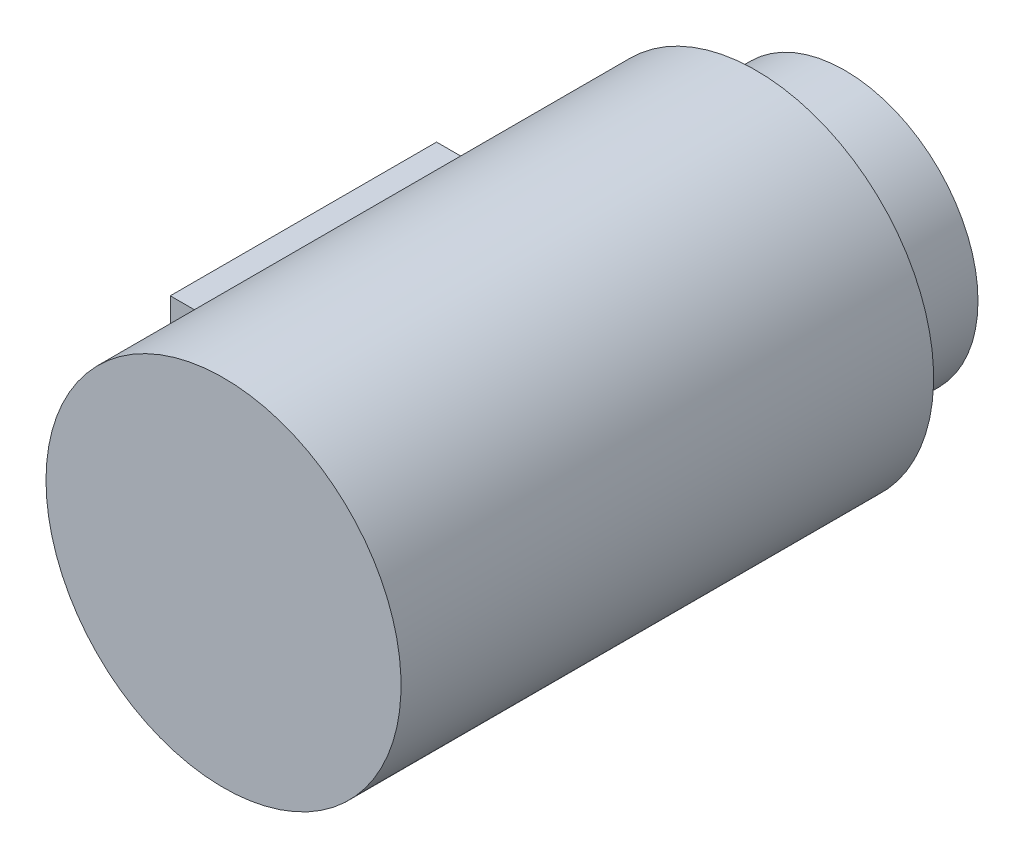
ISO-10303-21;
HEADER;
FILE_DESCRIPTION(('STEP AP214'),'2;1');
FILE_NAME('part.step','',(''),(''),'','','');
FILE_SCHEMA(('AUTOMOTIVE_DESIGN { 1 0 10303 214 1 1 1 1 }'));
ENDSEC;
DATA;
#1=APPLICATION_CONTEXT('core data for automotive mechanical design processes');
#2=APPLICATION_PROTOCOL_DEFINITION('international standard','automotive_design',2000,#1);
#3=PRODUCT_CONTEXT('',#1,'mechanical');
#4=PRODUCT('Part','Part','',(#3));
#5=PRODUCT_RELATED_PRODUCT_CATEGORY('part','',(#4));
#6=PRODUCT_DEFINITION_FORMATION('','',#4);
#7=PRODUCT_DEFINITION_CONTEXT('part definition',#1,'design');
#8=PRODUCT_DEFINITION('design','',#6,#7);
#9=PRODUCT_DEFINITION_SHAPE('','',#8);
#10=(LENGTH_UNIT() NAMED_UNIT(*) SI_UNIT(.MILLI.,.METRE.));
#11=(NAMED_UNIT(*) PLANE_ANGLE_UNIT() SI_UNIT($,.RADIAN.));
#12=(NAMED_UNIT(*) SI_UNIT($,.STERADIAN.) SOLID_ANGLE_UNIT());
#13=UNCERTAINTY_MEASURE_WITH_UNIT(LENGTH_MEASURE(1.E-05),#10,'distance_accuracy_value','');
#14=(GEOMETRIC_REPRESENTATION_CONTEXT(3) GLOBAL_UNCERTAINTY_ASSIGNED_CONTEXT((#13)) GLOBAL_UNIT_ASSIGNED_CONTEXT((#10,
#11,#12)) REPRESENTATION_CONTEXT('',''));
#15=CARTESIAN_POINT('',(0.,0.,0.));
#16=DIRECTION('',(0.,0.,1.));
#17=DIRECTION('',(1.,0.,0.));
#18=AXIS2_PLACEMENT_3D('',#15,#16,#17);
#19=CARTESIAN_POINT('',(0.,0.,-5.));
#20=DIRECTION('',(0.,0.,-1.));
#21=DIRECTION('',(-1.,0.,0.));
#22=AXIS2_PLACEMENT_3D('',#19,#20,#21);
#23=PLANE('',#22);
#24=CARTESIAN_POINT('',(0.,0.,-5.));
#25=DIRECTION('',(0.,0.,1.));
#26=DIRECTION('',(1.,0.,0.));
#27=AXIS2_PLACEMENT_3D('',#24,#25,#26);
#28=CIRCLE('',#27,7.5);
#29=CARTESIAN_POINT('',(7.5,0.,-5.));
#30=VERTEX_POINT('',#29);
#31=EDGE_CURVE('E20',#30,#30,#28,.T.);
#32=ORIENTED_EDGE('',*,*,#31,.F.);
#33=EDGE_LOOP('',(#32));
#34=FACE_BOUND('',#33,.T.);
#35=ADVANCED_FACE('F17',(#34),#23,.T.);
#36=CARTESIAN_POINT('',(0.,0.,-5.));
#37=DIRECTION('',(0.,0.,1.));
#38=DIRECTION('',(1.,0.,0.));
#39=AXIS2_PLACEMENT_3D('',#36,#37,#38);
#40=CYLINDRICAL_SURFACE('',#39,7.5);
#41=ORIENTED_EDGE('',*,*,#31,.T.);
#42=EDGE_LOOP('',(#41));
#43=FACE_BOUND('',#42,.T.);
#44=CARTESIAN_POINT('',(0.,0.,0.));
#45=DIRECTION('',(0.,0.,1.));
#46=DIRECTION('',(1.,0.,0.));
#47=AXIS2_PLACEMENT_3D('',#44,#45,#46);
#48=CIRCLE('',#47,7.5);
#49=CARTESIAN_POINT('',(7.5,0.,0.));
#50=VERTEX_POINT('',#49);
#51=EDGE_CURVE('E74',#50,#50,#48,.F.);
#52=ORIENTED_EDGE('',*,*,#51,.T.);
#53=EDGE_LOOP('',(#52));
#54=FACE_BOUND('',#53,.T.);
#55=ADVANCED_FACE('F189',(#43,#54),#40,.T.);
#56=CARTESIAN_POINT('',(-13.,0.,5.));
#57=DIRECTION('',(1.,0.,0.));
#58=DIRECTION('',(0.,0.,-1.));
#59=AXIS2_PLACEMENT_3D('',#56,#57,#58);
#60=PLANE('',#59);
#61=DIRECTION('',(0.,0.,1.));
#62=VECTOR('',#61,1.);
#63=CARTESIAN_POINT('',(-13.,2.5,5.));
#64=LINE('',#63,#62);
#65=CARTESIAN_POINT('',(-13.,2.5,5.));
#66=VERTEX_POINT('',#65);
#67=CARTESIAN_POINT('',(-13.,2.5,20.));
#68=VERTEX_POINT('',#67);
#69=EDGE_CURVE('E66',#66,#68,#64,.T.);
#70=ORIENTED_EDGE('',*,*,#69,.F.);
#71=DIRECTION('',(0.,1.,0.));
#72=VECTOR('',#71,1.);
#73=CARTESIAN_POINT('',(-13.,0.,5.));
#74=LINE('',#73,#72);
#75=CARTESIAN_POINT('',(-13.,-2.5,5.));
#76=VERTEX_POINT('',#75);
#77=EDGE_CURVE('E76',#66,#76,#74,.F.);
#78=ORIENTED_EDGE('',*,*,#77,.T.);
#79=DIRECTION('',(0.,0.,1.));
#80=VECTOR('',#79,1.);
#81=CARTESIAN_POINT('',(-13.,-2.5,5.));
#82=LINE('',#81,#80);
#83=CARTESIAN_POINT('',(-13.,-2.5,20.));
#84=VERTEX_POINT('',#83);
#85=EDGE_CURVE('E60',#76,#84,#82,.T.);
#86=ORIENTED_EDGE('',*,*,#85,.T.);
#87=DIRECTION('',(0.,1.,0.));
#88=VECTOR('',#87,1.);
#89=CARTESIAN_POINT('',(-13.,0.,20.));
#90=LINE('',#89,#88);
#91=EDGE_CURVE('E94',#68,#84,#90,.F.);
#92=ORIENTED_EDGE('',*,*,#91,.F.);
#93=EDGE_LOOP('',(#70,#78,#86,#92));
#94=FACE_BOUND('',#93,.T.);
#95=ADVANCED_FACE('F77',(#94),#60,.F.);
#96=CARTESIAN_POINT('',(0.,-2.5,5.));
#97=DIRECTION('',(0.,1.,0.));
#98=DIRECTION('',(0.,0.,1.));
#99=AXIS2_PLACEMENT_3D('',#96,#97,#98);
#100=PLANE('',#99);
#101=ORIENTED_EDGE('',*,*,#85,.F.);
#102=DIRECTION('',(1.,0.,0.));
#103=VECTOR('',#102,1.);
#104=CARTESIAN_POINT('',(0.,-2.5,5.));
#105=LINE('',#104,#103);
#106=CARTESIAN_POINT('',(-9.68245836551854,-2.5,5.));
#107=VERTEX_POINT('',#106);
#108=EDGE_CURVE('E71',#76,#107,#105,.T.);
#109=ORIENTED_EDGE('',*,*,#108,.T.);
#110=DIRECTION('',(0.,0.,-1.));
#111=VECTOR('',#110,1.);
#112=CARTESIAN_POINT('',(-9.68245836551854,-2.5,30.));
#113=LINE('',#112,#111);
#114=CARTESIAN_POINT('',(-9.68245836551854,-2.5,20.));
#115=VERTEX_POINT('',#114);
#116=EDGE_CURVE('E89',#115,#107,#113,.T.);
#117=ORIENTED_EDGE('',*,*,#116,.F.);
#118=DIRECTION('',(1.,0.,0.));
#119=VECTOR('',#118,1.);
#120=CARTESIAN_POINT('',(0.,-2.5,20.));
#121=LINE('',#120,#119);
#122=EDGE_CURVE('E72',#84,#115,#121,.T.);
#123=ORIENTED_EDGE('',*,*,#122,.F.);
#124=EDGE_LOOP('',(#101,#109,#117,#123));
#125=FACE_BOUND('',#124,.T.);
#126=ADVANCED_FACE('F69',(#125),#100,.F.);
#127=CARTESIAN_POINT('',(0.,0.,30.));
#128=DIRECTION('',(0.,0.,1.));
#129=DIRECTION('',(1.,0.,0.));
#130=AXIS2_PLACEMENT_3D('',#127,#128,#129);
#131=PLANE('',#130);
#132=CARTESIAN_POINT('',(0.,0.,30.));
#133=DIRECTION('',(0.,0.,-1.));
#134=DIRECTION('',(-1.,0.,0.));
#135=AXIS2_PLACEMENT_3D('',#132,#133,#134);
#136=CIRCLE('',#135,10.);
#137=CARTESIAN_POINT('',(-10.,0.,30.));
#138=VERTEX_POINT('',#137);
#139=EDGE_CURVE('E90',#138,#138,#136,.T.);
#140=ORIENTED_EDGE('',*,*,#139,.F.);
#141=EDGE_LOOP('',(#140));
#142=FACE_BOUND('',#141,.T.);
#143=ADVANCED_FACE('F113',(#142),#131,.T.);
#144=CARTESIAN_POINT('',(0.,0.,0.));
#145=DIRECTION('',(0.,0.,1.));
#146=DIRECTION('',(1.,0.,0.));
#147=AXIS2_PLACEMENT_3D('',#144,#145,#146);
#148=PLANE('',#147);
#149=ORIENTED_EDGE('',*,*,#51,.F.);
#150=EDGE_LOOP('',(#149));
#151=FACE_BOUND('',#150,.T.);
#152=CARTESIAN_POINT('',(0.,0.,0.));
#153=DIRECTION('',(0.,0.,-1.));
#154=DIRECTION('',(-1.,0.,0.));
#155=AXIS2_PLACEMENT_3D('',#152,#153,#154);
#156=CIRCLE('',#155,10.);
#157=CARTESIAN_POINT('',(-10.,0.,0.));
#158=VERTEX_POINT('',#157);
#159=EDGE_CURVE('E105',#158,#158,#156,.F.);
#160=ORIENTED_EDGE('',*,*,#159,.F.);
#161=EDGE_LOOP('',(#160));
#162=FACE_BOUND('',#161,.T.);
#163=ADVANCED_FACE('F115',(#151,#162),#148,.F.);
#164=CARTESIAN_POINT('',(0.,0.,5.));
#165=DIRECTION('',(0.,0.,1.));
#166=DIRECTION('',(1.,0.,0.));
#167=AXIS2_PLACEMENT_3D('',#164,#165,#166);
#168=PLANE('',#167);
#169=DIRECTION('',(1.,0.,0.));
#170=VECTOR('',#169,1.);
#171=CARTESIAN_POINT('',(0.,2.5,5.));
#172=LINE('',#171,#170);
#173=CARTESIAN_POINT('',(-9.68245836551854,2.5,5.));
#174=VERTEX_POINT('',#173);
#175=EDGE_CURVE('E99',#174,#66,#172,.F.);
#176=ORIENTED_EDGE('',*,*,#175,.F.);
#177=CARTESIAN_POINT('',(0.,0.,5.));
#178=DIRECTION('',(0.,0.,-1.));
#179=DIRECTION('',(-1.,0.,0.));
#180=AXIS2_PLACEMENT_3D('',#177,#178,#179);
#181=CIRCLE('',#180,10.);
#182=EDGE_CURVE('E47',#107,#174,#181,.T.);
#183=ORIENTED_EDGE('',*,*,#182,.F.);
#184=ORIENTED_EDGE('',*,*,#108,.F.);
#185=ORIENTED_EDGE('',*,*,#77,.F.);
#186=EDGE_LOOP('',(#176,#183,#184,#185));
#187=FACE_BOUND('',#186,.T.);
#188=ADVANCED_FACE('F80',(#187),#168,.F.);
#189=CARTESIAN_POINT('',(0.,2.5,5.));
#190=DIRECTION('',(0.,1.,0.));
#191=DIRECTION('',(0.,0.,1.));
#192=AXIS2_PLACEMENT_3D('',#189,#190,#191);
#193=PLANE('',#192);
#194=DIRECTION('',(0.,0.,-1.));
#195=VECTOR('',#194,1.);
#196=CARTESIAN_POINT('',(-9.68245836551854,2.5,30.));
#197=LINE('',#196,#195);
#198=CARTESIAN_POINT('',(-9.68245836551854,2.5,20.));
#199=VERTEX_POINT('',#198);
#200=EDGE_CURVE('E26',#174,#199,#197,.F.);
#201=ORIENTED_EDGE('',*,*,#200,.F.);
#202=ORIENTED_EDGE('',*,*,#175,.T.);
#203=ORIENTED_EDGE('',*,*,#69,.T.);
#204=DIRECTION('',(1.,0.,0.));
#205=VECTOR('',#204,1.);
#206=CARTESIAN_POINT('',(0.,2.5,20.));
#207=LINE('',#206,#205);
#208=EDGE_CURVE('E35',#199,#68,#207,.F.);
#209=ORIENTED_EDGE('',*,*,#208,.F.);
#210=EDGE_LOOP('',(#201,#202,#203,#209));
#211=FACE_BOUND('',#210,.T.);
#212=ADVANCED_FACE('F132',(#211),#193,.T.);
#213=CARTESIAN_POINT('',(0.,0.,20.));
#214=DIRECTION('',(0.,0.,1.));
#215=DIRECTION('',(1.,0.,0.));
#216=AXIS2_PLACEMENT_3D('',#213,#214,#215);
#217=PLANE('',#216);
#218=ORIENTED_EDGE('',*,*,#122,.T.);
#219=CARTESIAN_POINT('',(0.,0.,20.));
#220=DIRECTION('',(0.,0.,-1.));
#221=DIRECTION('',(-1.,0.,0.));
#222=AXIS2_PLACEMENT_3D('',#219,#220,#221);
#223=CIRCLE('',#222,10.);
#224=EDGE_CURVE('E11',#199,#115,#223,.F.);
#225=ORIENTED_EDGE('',*,*,#224,.F.);
#226=ORIENTED_EDGE('',*,*,#208,.T.);
#227=ORIENTED_EDGE('',*,*,#91,.T.);
#228=EDGE_LOOP('',(#218,#225,#226,#227));
#229=FACE_BOUND('',#228,.T.);
#230=ADVANCED_FACE('F126',(#229),#217,.T.);
#231=CARTESIAN_POINT('',(0.,0.,30.));
#232=DIRECTION('',(0.,0.,-1.));
#233=DIRECTION('',(-1.,0.,0.));
#234=AXIS2_PLACEMENT_3D('',#231,#232,#233);
#235=CYLINDRICAL_SURFACE('',#234,10.);
#236=ORIENTED_EDGE('',*,*,#159,.T.);
#237=EDGE_LOOP('',(#236));
#238=FACE_BOUND('',#237,.T.);
#239=ORIENTED_EDGE('',*,*,#116,.T.);
#240=ORIENTED_EDGE('',*,*,#182,.T.);
#241=ORIENTED_EDGE('',*,*,#200,.T.);
#242=ORIENTED_EDGE('',*,*,#224,.T.);
#243=EDGE_LOOP('',(#239,#240,#241,#242));
#244=FACE_BOUND('',#243,.T.);
#245=ORIENTED_EDGE('',*,*,#139,.T.);
#246=EDGE_LOOP('',(#245));
#247=FACE_BOUND('',#246,.T.);
#248=ADVANCED_FACE('F111',(#238,#244,#247),#235,.T.);
#249=CLOSED_SHELL('',(#35,#55,#95,#126,#143,#163,#188,#212,#230,#248));
#250=MANIFOLD_SOLID_BREP('B1',#249);
#251=ADVANCED_BREP_SHAPE_REPRESENTATION('',(#18,#250),#14);
#252=SHAPE_DEFINITION_REPRESENTATION(#9,#251);
ENDSEC;
END-ISO-10303-21;
